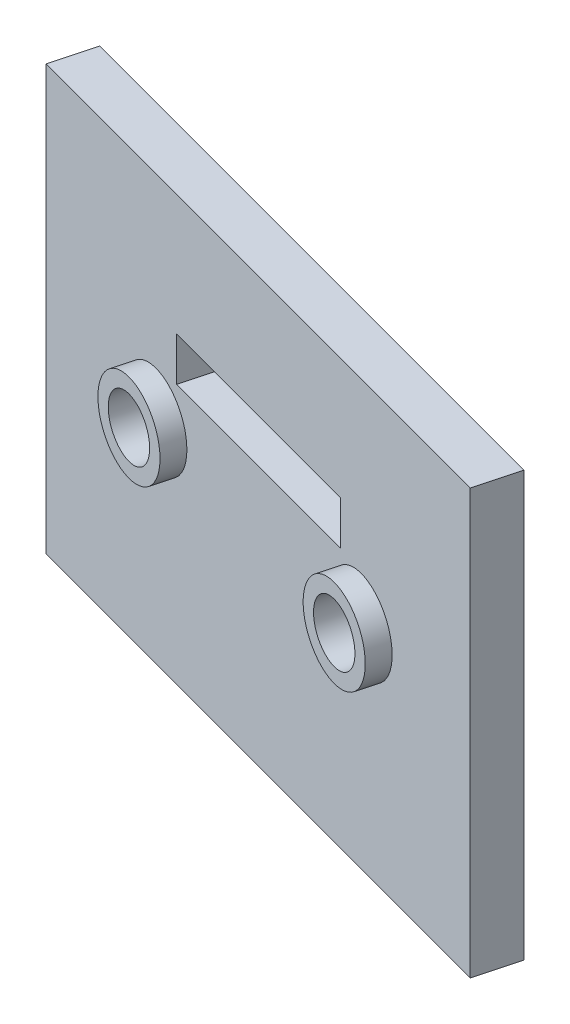
ISO-10303-21;
HEADER;
FILE_DESCRIPTION(('STEP AP214'),'2;1');
FILE_NAME('part.step','',(''),(''),'','','');
FILE_SCHEMA(('AUTOMOTIVE_DESIGN { 1 0 10303 214 1 1 1 1 }'));
ENDSEC;
DATA;
#1=APPLICATION_CONTEXT('core data for automotive mechanical design processes');
#2=APPLICATION_PROTOCOL_DEFINITION('international standard','automotive_design',2000,#1);
#3=PRODUCT_CONTEXT('',#1,'mechanical');
#4=PRODUCT('Part','Part','',(#3));
#5=PRODUCT_RELATED_PRODUCT_CATEGORY('part','',(#4));
#6=PRODUCT_DEFINITION_FORMATION('','',#4);
#7=PRODUCT_DEFINITION_CONTEXT('part definition',#1,'design');
#8=PRODUCT_DEFINITION('design','',#6,#7);
#9=PRODUCT_DEFINITION_SHAPE('','',#8);
#10=(LENGTH_UNIT() NAMED_UNIT(*) SI_UNIT(.MILLI.,.METRE.));
#11=(NAMED_UNIT(*) PLANE_ANGLE_UNIT() SI_UNIT($,.RADIAN.));
#12=(NAMED_UNIT(*) SI_UNIT($,.STERADIAN.) SOLID_ANGLE_UNIT());
#13=UNCERTAINTY_MEASURE_WITH_UNIT(LENGTH_MEASURE(1.E-05),#10,'distance_accuracy_value','');
#14=(GEOMETRIC_REPRESENTATION_CONTEXT(3) GLOBAL_UNCERTAINTY_ASSIGNED_CONTEXT((#13)) GLOBAL_UNIT_ASSIGNED_CONTEXT((#10,
#11,#12)) REPRESENTATION_CONTEXT('',''));
#15=CARTESIAN_POINT('',(0.,0.,0.));
#16=DIRECTION('',(0.,0.,1.));
#17=DIRECTION('',(1.,0.,0.));
#18=AXIS2_PLACEMENT_3D('',#15,#16,#17);
#19=CARTESIAN_POINT('',(47.9030584365936,15.,8.28023479431847));
#20=DIRECTION('',(-0.965925826289069,0.,-0.258819045102521));
#21=DIRECTION('',(-0.258819045102521,0.,0.965925826289069));
#22=AXIS2_PLACEMENT_3D('',#19,#20,#21);
#23=PLANE('',#22);
#24=DIRECTION('',(0.,1.,0.));
#25=VECTOR('',#24,1.);
#26=CARTESIAN_POINT('',(48.6795155719012,15.,5.38245731545126));
#27=LINE('',#26,#25);
#28=CARTESIAN_POINT('',(48.6795155719012,-14.,5.38245731545126));
#29=VERTEX_POINT('',#28);
#30=CARTESIAN_POINT('',(48.6795155719012,15.,5.38245731545126));
#31=VERTEX_POINT('',#30);
#32=EDGE_CURVE('E153',#29,#31,#27,.T.);
#33=ORIENTED_EDGE('',*,*,#32,.T.);
#34=DIRECTION('',(0.258819045102521,0.,-0.965925826289069));
#35=VECTOR('',#34,1.);
#36=CARTESIAN_POINT('',(47.9030584365936,15.,8.28023479431847));
#37=LINE('',#36,#35);
#38=CARTESIAN_POINT('',(47.9030584365936,15.,8.28023479431847));
#39=VERTEX_POINT('',#38);
#40=EDGE_CURVE('E46',#39,#31,#37,.T.);
#41=ORIENTED_EDGE('',*,*,#40,.F.);
#42=DIRECTION('',(0.,1.,0.));
#43=VECTOR('',#42,1.);
#44=CARTESIAN_POINT('',(47.9030584365936,15.,8.28023479431847));
#45=LINE('',#44,#43);
#46=CARTESIAN_POINT('',(47.9030584365936,-14.,8.28023479431847));
#47=VERTEX_POINT('',#46);
#48=EDGE_CURVE('E156',#47,#39,#45,.T.);
#49=ORIENTED_EDGE('',*,*,#48,.F.);
#50=DIRECTION('',(0.258819045102521,0.,-0.965925826289069));
#51=VECTOR('',#50,1.);
#52=CARTESIAN_POINT('',(47.9030584365936,-14.,8.28023479431847));
#53=LINE('',#52,#51);
#54=EDGE_CURVE('E166',#47,#29,#53,.T.);
#55=ORIENTED_EDGE('',*,*,#54,.T.);
#56=EDGE_LOOP('',(#33,#41,#49,#55));
#57=FACE_BOUND('',#56,.T.);
#58=ADVANCED_FACE('F39',(#57),#23,.F.);
#59=CARTESIAN_POINT('',(8.3000995587418,15.,-2.33134605488488));
#60=DIRECTION('',(0.,-1.,0.));
#61=DIRECTION('',(0.258819045102521,0.,-0.965925826289069));
#62=AXIS2_PLACEMENT_3D('',#59,#60,#61);
#63=PLANE('',#62);
#64=DIRECTION('',(-0.965925826289069,0.,-0.258819045102521));
#65=VECTOR('',#64,1.);
#66=CARTESIAN_POINT('',(9.07655669404936,15.,-5.22912353375209));
#67=LINE('',#66,#65);
#68=CARTESIAN_POINT('',(9.07655669404936,15.,-5.22912353375209));
#69=VERTEX_POINT('',#68);
#70=EDGE_CURVE('E169',#31,#69,#67,.T.);
#71=ORIENTED_EDGE('',*,*,#70,.T.);
#72=DIRECTION('',(0.258819045102521,0.,-0.965925826289069));
#73=VECTOR('',#72,1.);
#74=CARTESIAN_POINT('',(8.3000995587418,15.,-2.33134605488488));
#75=LINE('',#74,#73);
#76=CARTESIAN_POINT('',(8.3000995587418,15.,-2.33134605488488));
#77=VERTEX_POINT('',#76);
#78=EDGE_CURVE('E179',#77,#69,#75,.T.);
#79=ORIENTED_EDGE('',*,*,#78,.F.);
#80=DIRECTION('',(-0.965925826289069,0.,-0.258819045102521));
#81=VECTOR('',#80,1.);
#82=CARTESIAN_POINT('',(8.3000995587418,15.,-2.33134605488488));
#83=LINE('',#82,#81);
#84=EDGE_CURVE('E159',#39,#77,#83,.T.);
#85=ORIENTED_EDGE('',*,*,#84,.F.);
#86=ORIENTED_EDGE('',*,*,#40,.T.);
#87=EDGE_LOOP('',(#71,#79,#85,#86));
#88=FACE_BOUND('',#87,.T.);
#89=ADVANCED_FACE('F184',(#88),#63,.F.);
#90=CARTESIAN_POINT('',(8.3000995587418,15.,-2.33134605488488));
#91=DIRECTION('',(0.965925826289069,0.,0.258819045102521));
#92=DIRECTION('',(0.,1.,0.));
#93=AXIS2_PLACEMENT_3D('',#90,#91,#92);
#94=PLANE('',#93);
#95=DIRECTION('',(0.,-1.,0.));
#96=VECTOR('',#95,1.);
#97=CARTESIAN_POINT('',(9.07655669404936,15.,-5.22912353375209));
#98=LINE('',#97,#96);
#99=CARTESIAN_POINT('',(9.07655669404937,-14.,-5.22912353375209));
#100=VERTEX_POINT('',#99);
#101=EDGE_CURVE('E171',#69,#100,#98,.T.);
#102=ORIENTED_EDGE('',*,*,#101,.T.);
#103=DIRECTION('',(0.258819045102521,0.,-0.965925826289069));
#104=VECTOR('',#103,1.);
#105=CARTESIAN_POINT('',(8.3000995587418,-14.,-2.33134605488488));
#106=LINE('',#105,#104);
#107=CARTESIAN_POINT('',(8.3000995587418,-14.,-2.33134605488488));
#108=VERTEX_POINT('',#107);
#109=EDGE_CURVE('E176',#108,#100,#106,.T.);
#110=ORIENTED_EDGE('',*,*,#109,.F.);
#111=DIRECTION('',(0.,-1.,0.));
#112=VECTOR('',#111,1.);
#113=CARTESIAN_POINT('',(8.3000995587418,15.,-2.33134605488488));
#114=LINE('',#113,#112);
#115=EDGE_CURVE('E162',#77,#108,#114,.T.);
#116=ORIENTED_EDGE('',*,*,#115,.F.);
#117=ORIENTED_EDGE('',*,*,#78,.T.);
#118=EDGE_LOOP('',(#102,#110,#116,#117));
#119=FACE_BOUND('',#118,.T.);
#120=ADVANCED_FACE('F195',(#119),#94,.F.);
#121=CARTESIAN_POINT('',(8.3000995587418,-14.,-2.33134605488488));
#122=DIRECTION('',(0.,1.,0.));
#123=DIRECTION('',(-0.258819045102521,0.,0.965925826289069));
#124=AXIS2_PLACEMENT_3D('',#121,#122,#123);
#125=PLANE('',#124);
#126=DIRECTION('',(0.965925826289069,0.,0.258819045102521));
#127=VECTOR('',#126,1.);
#128=CARTESIAN_POINT('',(9.07655669404937,-14.,-5.22912353375209));
#129=LINE('',#128,#127);
#130=EDGE_CURVE('E160',#100,#29,#129,.T.);
#131=ORIENTED_EDGE('',*,*,#130,.T.);
#132=ORIENTED_EDGE('',*,*,#54,.F.);
#133=DIRECTION('',(0.965925826289069,0.,0.258819045102521));
#134=VECTOR('',#133,1.);
#135=CARTESIAN_POINT('',(8.3000995587418,-14.,-2.33134605488488));
#136=LINE('',#135,#134);
#137=EDGE_CURVE('E164',#108,#47,#136,.T.);
#138=ORIENTED_EDGE('',*,*,#137,.F.);
#139=ORIENTED_EDGE('',*,*,#109,.T.);
#140=EDGE_LOOP('',(#131,#132,#138,#139));
#141=FACE_BOUND('',#140,.T.);
#142=ADVANCED_FACE('F199',(#141),#125,.F.);
#143=CARTESIAN_POINT('',(28.1015789976677,0.5,2.97444436971679));
#144=DIRECTION('',(-0.258819045102521,0.,0.965925826289069));
#145=DIRECTION('',(0.965925826289069,0.,0.258819045102521));
#146=AXIS2_PLACEMENT_3D('',#143,#144,#145);
#147=PLANE('',#146);
#148=DIRECTION('',(0.,1.,0.));
#149=VECTOR('',#148,1.);
#150=CARTESIAN_POINT('',(35.7835278321749,0.5,5.03281635622019));
#151=LINE('',#150,#149);
#152=CARTESIAN_POINT('',(35.7835278321749,3.75000000000001,5.0328163562202));
#153=VERTEX_POINT('',#152);
#154=CARTESIAN_POINT('',(35.7835278321749,6.75000000000001,5.0328163562202));
#155=VERTEX_POINT('',#154);
#156=EDGE_CURVE('E125',#153,#155,#151,.T.);
#157=ORIENTED_EDGE('',*,*,#156,.F.);
#158=DIRECTION('',(0.965925826289068,0.,0.258819045102521));
#159=VECTOR('',#158,1.);
#160=CARTESIAN_POINT('',(28.1015789976677,3.75000000000001,2.97444436971679));
#161=LINE('',#160,#159);
#162=CARTESIAN_POINT('',(20.4830859415634,3.75000000000001,0.93307530779153));
#163=VERTEX_POINT('',#162);
#164=EDGE_CURVE('E127',#163,#153,#161,.T.);
#165=ORIENTED_EDGE('',*,*,#164,.F.);
#166=DIRECTION('',(0.,-1.,0.));
#167=VECTOR('',#166,1.);
#168=CARTESIAN_POINT('',(20.4830859415634,0.5,0.933075307791529));
#169=LINE('',#168,#167);
#170=CARTESIAN_POINT('',(20.4830859415634,6.75000000000001,0.933075307791529));
#171=VERTEX_POINT('',#170);
#172=EDGE_CURVE('E106',#171,#163,#169,.T.);
#173=ORIENTED_EDGE('',*,*,#172,.F.);
#174=DIRECTION('',(-0.965925826289068,0.,-0.258819045102521));
#175=VECTOR('',#174,1.);
#176=CARTESIAN_POINT('',(28.1015789976677,6.75000000000001,2.97444436971679));
#177=LINE('',#176,#175);
#178=EDGE_CURVE('E129',#155,#171,#177,.T.);
#179=ORIENTED_EDGE('',*,*,#178,.F.);
#180=EDGE_LOOP('',(#157,#165,#173,#179));
#181=FACE_BOUND('',#180,.T.);
#182=CARTESIAN_POINT('',(37.715379484753,0.500000000000006,5.55045444642524));
#183=DIRECTION('',(-0.258819045102521,0.,0.965925826289069));
#184=DIRECTION('',(0.965925826289069,0.,0.258819045102521));
#185=AXIS2_PLACEMENT_3D('',#182,#183,#184);
#186=CIRCLE('',#185,3.);
#187=CARTESIAN_POINT('',(40.6131569636202,0.500000000000006,6.3269115817328));
#188=VERTEX_POINT('',#187);
#189=EDGE_CURVE('E143',#188,#188,#186,.T.);
#190=ORIENTED_EDGE('',*,*,#189,.F.);
#191=EDGE_LOOP('',(#190));
#192=FACE_BOUND('',#191,.T.);
#193=CARTESIAN_POINT('',(18.5512342889853,0.500000000000006,0.415437217586492));
#194=DIRECTION('',(-0.258819045102521,0.,0.965925826289069));
#195=DIRECTION('',(0.965925826289069,0.,0.258819045102521));
#196=AXIS2_PLACEMENT_3D('',#193,#194,#195);
#197=CIRCLE('',#196,3.);
#198=CARTESIAN_POINT('',(21.4490117678525,0.500000000000006,1.19189435289405));
#199=VERTEX_POINT('',#198);
#200=EDGE_CURVE('E147',#199,#199,#197,.T.);
#201=ORIENTED_EDGE('',*,*,#200,.F.);
#202=EDGE_LOOP('',(#201));
#203=FACE_BOUND('',#202,.T.);
#204=ORIENTED_EDGE('',*,*,#48,.T.);
#205=ORIENTED_EDGE('',*,*,#84,.T.);
#206=ORIENTED_EDGE('',*,*,#115,.T.);
#207=ORIENTED_EDGE('',*,*,#137,.T.);
#208=EDGE_LOOP('',(#204,#205,#206,#207));
#209=FACE_BOUND('',#208,.T.);
#210=ADVANCED_FACE('F201',(#181,#192,#203,#209),#147,.T.);
#211=CARTESIAN_POINT('',(28.8780361329753,0.5,0.0766668908495881));
#212=DIRECTION('',(-0.258819045102521,0.,0.965925826289069));
#213=DIRECTION('',(0.965925826289069,0.,0.258819045102521));
#214=AXIS2_PLACEMENT_3D('',#211,#212,#213);
#215=PLANE('',#214);
#216=CARTESIAN_POINT('',(38.4918366200606,0.500000000000006,2.65267696755803));
#217=DIRECTION('',(-0.258819045102521,0.,0.965925826289069));
#218=DIRECTION('',(0.965925826289069,0.,0.258819045102521));
#219=AXIS2_PLACEMENT_3D('',#216,#217,#218);
#220=CIRCLE('',#219,2.);
#221=CARTESIAN_POINT('',(40.4236882726387,0.500000000000006,3.17031505776307));
#222=VERTEX_POINT('',#221);
#223=EDGE_CURVE('E140',#222,#222,#220,.T.);
#224=ORIENTED_EDGE('',*,*,#223,.T.);
#225=EDGE_LOOP('',(#224));
#226=FACE_BOUND('',#225,.T.);
#227=DIRECTION('',(-0.965925826289068,0.,-0.258819045102521));
#228=VECTOR('',#227,1.);
#229=CARTESIAN_POINT('',(36.5599849674824,3.75000000000001,2.13503887735299));
#230=LINE('',#229,#228);
#231=CARTESIAN_POINT('',(36.5599849674824,3.75000000000001,2.13503887735299));
#232=VERTEX_POINT('',#231);
#233=CARTESIAN_POINT('',(21.259543076871,3.75000000000001,-1.96470217107567));
#234=VERTEX_POINT('',#233);
#235=EDGE_CURVE('E111',#232,#234,#230,.T.);
#236=ORIENTED_EDGE('',*,*,#235,.F.);
#237=DIRECTION('',(0.,1.,0.));
#238=VECTOR('',#237,1.);
#239=CARTESIAN_POINT('',(36.5599849674824,0.5,2.13503887735299));
#240=LINE('',#239,#238);
#241=CARTESIAN_POINT('',(36.5599849674824,6.75000000000001,2.13503887735299));
#242=VERTEX_POINT('',#241);
#243=EDGE_CURVE('E120',#232,#242,#240,.T.);
#244=ORIENTED_EDGE('',*,*,#243,.T.);
#245=DIRECTION('',(-0.965925826289068,0.,-0.258819045102521));
#246=VECTOR('',#245,1.);
#247=CARTESIAN_POINT('',(28.8780361329753,6.75000000000001,0.0766668908495881));
#248=LINE('',#247,#246);
#249=CARTESIAN_POINT('',(21.259543076871,6.75000000000001,-1.96470217107568));
#250=VERTEX_POINT('',#249);
#251=EDGE_CURVE('E11',#242,#250,#248,.T.);
#252=ORIENTED_EDGE('',*,*,#251,.T.);
#253=DIRECTION('',(0.,-1.,0.));
#254=VECTOR('',#253,1.);
#255=CARTESIAN_POINT('',(21.259543076871,0.5,-1.96470217107568));
#256=LINE('',#255,#254);
#257=EDGE_CURVE('E103',#250,#234,#256,.T.);
#258=ORIENTED_EDGE('',*,*,#257,.T.);
#259=EDGE_LOOP('',(#236,#244,#252,#258));
#260=FACE_BOUND('',#259,.T.);
#261=CARTESIAN_POINT('',(19.3276914242928,0.500000000000006,-2.48234026128071));
#262=DIRECTION('',(-0.258819045102521,0.,0.965925826289069));
#263=DIRECTION('',(0.965925826289069,0.,0.258819045102521));
#264=AXIS2_PLACEMENT_3D('',#261,#262,#263);
#265=CIRCLE('',#264,2.);
#266=CARTESIAN_POINT('',(21.259543076871,0.500000000000006,-1.96470217107567));
#267=VERTEX_POINT('',#266);
#268=EDGE_CURVE('E134',#267,#267,#265,.T.);
#269=ORIENTED_EDGE('',*,*,#268,.T.);
#270=EDGE_LOOP('',(#269));
#271=FACE_BOUND('',#270,.T.);
#272=ORIENTED_EDGE('',*,*,#32,.F.);
#273=ORIENTED_EDGE('',*,*,#130,.F.);
#274=ORIENTED_EDGE('',*,*,#101,.F.);
#275=ORIENTED_EDGE('',*,*,#70,.F.);
#276=EDGE_LOOP('',(#272,#273,#274,#275));
#277=FACE_BOUND('',#276,.T.);
#278=ADVANCED_FACE('F117',(#226,#260,#271,#277),#215,.F.);
#279=CARTESIAN_POINT('',(18.1630057213315,0.500000000000006,1.8643259570201));
#280=DIRECTION('',(0.258819045102521,0.,-0.965925826289069));
#281=DIRECTION('',(-0.965925826289069,0.,-0.258819045102521));
#282=AXIS2_PLACEMENT_3D('',#279,#280,#281);
#283=CYLINDRICAL_SURFACE('',#282,3.);
#284=CARTESIAN_POINT('',(18.1630057213315,0.500000000000006,1.8643259570201));
#285=DIRECTION('',(-0.258819045102521,0.,0.965925826289069));
#286=DIRECTION('',(0.965925826289069,0.,0.258819045102521));
#287=AXIS2_PLACEMENT_3D('',#284,#285,#286);
#288=CIRCLE('',#287,3.);
#289=CARTESIAN_POINT('',(21.0607832001987,0.500000000000006,2.64078309232766));
#290=VERTEX_POINT('',#289);
#291=EDGE_CURVE('E150',#290,#290,#288,.T.);
#292=ORIENTED_EDGE('',*,*,#291,.F.);
#293=EDGE_LOOP('',(#292));
#294=FACE_BOUND('',#293,.T.);
#295=ORIENTED_EDGE('',*,*,#200,.T.);
#296=EDGE_LOOP('',(#295));
#297=FACE_BOUND('',#296,.T.);
#298=ADVANCED_FACE('F207',(#294,#297),#283,.T.);
#299=CARTESIAN_POINT('',(18.1630057213315,0.500000000000006,1.8643259570201));
#300=DIRECTION('',(-0.258819045102521,0.,0.965925826289069));
#301=DIRECTION('',(0.965925826289069,0.,0.258819045102521));
#302=AXIS2_PLACEMENT_3D('',#299,#300,#301);
#303=PLANE('',#302);
#304=CARTESIAN_POINT('',(18.1630057213315,0.500000000000006,1.8643259570201));
#305=DIRECTION('',(-0.258819045102521,0.,0.965925826289069));
#306=DIRECTION('',(0.965925826289069,0.,0.258819045102521));
#307=AXIS2_PLACEMENT_3D('',#304,#305,#306);
#308=CIRCLE('',#307,2.);
#309=CARTESIAN_POINT('',(20.0948573739096,0.500000000000006,2.38196404722514));
#310=VERTEX_POINT('',#309);
#311=EDGE_CURVE('E131',#310,#310,#308,.T.);
#312=ORIENTED_EDGE('',*,*,#311,.F.);
#313=EDGE_LOOP('',(#312));
#314=FACE_BOUND('',#313,.T.);
#315=ORIENTED_EDGE('',*,*,#291,.T.);
#316=EDGE_LOOP('',(#315));
#317=FACE_BOUND('',#316,.T.);
#318=ADVANCED_FACE('F237',(#314,#317),#303,.T.);
#319=CARTESIAN_POINT('',(37.3271509170992,0.500000000000006,6.99934318585884));
#320=DIRECTION('',(0.258819045102521,0.,-0.965925826289069));
#321=DIRECTION('',(-0.965925826289069,0.,-0.258819045102521));
#322=AXIS2_PLACEMENT_3D('',#319,#320,#321);
#323=CYLINDRICAL_SURFACE('',#322,3.);
#324=CARTESIAN_POINT('',(37.3271509170992,0.500000000000006,6.99934318585884));
#325=DIRECTION('',(-0.258819045102521,0.,0.965925826289069));
#326=DIRECTION('',(0.965925826289069,0.,0.258819045102521));
#327=AXIS2_PLACEMENT_3D('',#324,#325,#326);
#328=CIRCLE('',#327,3.);
#329=CARTESIAN_POINT('',(40.2249283959665,0.500000000000006,7.7758003211664));
#330=VERTEX_POINT('',#329);
#331=EDGE_CURVE('E144',#330,#330,#328,.T.);
#332=ORIENTED_EDGE('',*,*,#331,.F.);
#333=EDGE_LOOP('',(#332));
#334=FACE_BOUND('',#333,.T.);
#335=ORIENTED_EDGE('',*,*,#189,.T.);
#336=EDGE_LOOP('',(#335));
#337=FACE_BOUND('',#336,.T.);
#338=ADVANCED_FACE('F232',(#334,#337),#323,.T.);
#339=CARTESIAN_POINT('',(37.3271509170992,0.500000000000006,6.99934318585884));
#340=DIRECTION('',(-0.258819045102521,0.,0.965925826289069));
#341=DIRECTION('',(0.965925826289069,0.,0.258819045102521));
#342=AXIS2_PLACEMENT_3D('',#339,#340,#341);
#343=PLANE('',#342);
#344=CARTESIAN_POINT('',(37.3271509170992,0.500000000000006,6.99934318585884));
#345=DIRECTION('',(-0.258819045102521,0.,0.965925826289069));
#346=DIRECTION('',(0.965925826289069,0.,0.258819045102521));
#347=AXIS2_PLACEMENT_3D('',#344,#345,#346);
#348=CIRCLE('',#347,2.);
#349=CARTESIAN_POINT('',(39.2590025696774,0.500000000000006,7.51698127606388));
#350=VERTEX_POINT('',#349);
#351=EDGE_CURVE('E137',#350,#350,#348,.T.);
#352=ORIENTED_EDGE('',*,*,#351,.F.);
#353=EDGE_LOOP('',(#352));
#354=FACE_BOUND('',#353,.T.);
#355=ORIENTED_EDGE('',*,*,#331,.T.);
#356=EDGE_LOOP('',(#355));
#357=FACE_BOUND('',#356,.T.);
#358=ADVANCED_FACE('F236',(#354,#357),#343,.T.);
#359=CARTESIAN_POINT('',(37.3271509170992,0.500000000000006,6.99934318585884));
#360=DIRECTION('',(-0.258819045102521,0.,0.965925826289069));
#361=DIRECTION('',(0.965925826289069,0.,0.258819045102521));
#362=AXIS2_PLACEMENT_3D('',#359,#360,#361);
#363=CYLINDRICAL_SURFACE('',#362,2.);
#364=ORIENTED_EDGE('',*,*,#223,.F.);
#365=EDGE_LOOP('',(#364));
#366=FACE_BOUND('',#365,.T.);
#367=ORIENTED_EDGE('',*,*,#351,.T.);
#368=EDGE_LOOP('',(#367));
#369=FACE_BOUND('',#368,.T.);
#370=ADVANCED_FACE('F246',(#366,#369),#363,.F.);
#371=CARTESIAN_POINT('',(18.1630057213315,0.500000000000006,1.8643259570201));
#372=DIRECTION('',(-0.258819045102521,0.,0.965925826289069));
#373=DIRECTION('',(0.965925826289069,0.,0.258819045102521));
#374=AXIS2_PLACEMENT_3D('',#371,#372,#373);
#375=CYLINDRICAL_SURFACE('',#374,2.);
#376=ORIENTED_EDGE('',*,*,#268,.F.);
#377=EDGE_LOOP('',(#376));
#378=FACE_BOUND('',#377,.T.);
#379=ORIENTED_EDGE('',*,*,#311,.T.);
#380=EDGE_LOOP('',(#379));
#381=FACE_BOUND('',#380,.T.);
#382=ADVANCED_FACE('F257',(#378,#381),#375,.F.);
#383=CARTESIAN_POINT('',(32.6776992909446,6.75000000000001,16.623926271689));
#384=DIRECTION('',(0.,1.,0.));
#385=DIRECTION('',(0.,0.,1.));
#386=AXIS2_PLACEMENT_3D('',#383,#384,#385);
#387=PLANE('',#386);
#388=ORIENTED_EDGE('',*,*,#178,.T.);
#389=DIRECTION('',(0.258819045102521,0.,-0.965925826289068));
#390=VECTOR('',#389,1.);
#391=CARTESIAN_POINT('',(17.3772574003332,6.75000000000001,12.5241852232604));
#392=LINE('',#391,#390);
#393=EDGE_CURVE('E108',#171,#250,#392,.T.);
#394=ORIENTED_EDGE('',*,*,#393,.T.);
#395=ORIENTED_EDGE('',*,*,#251,.F.);
#396=DIRECTION('',(0.258819045102521,0.,-0.965925826289068));
#397=VECTOR('',#396,1.);
#398=CARTESIAN_POINT('',(32.6776992909446,6.75000000000001,16.623926271689));
#399=LINE('',#398,#397);
#400=EDGE_CURVE('E115',#155,#242,#399,.T.);
#401=ORIENTED_EDGE('',*,*,#400,.F.);
#402=EDGE_LOOP('',(#388,#394,#395,#401));
#403=FACE_BOUND('',#402,.T.);
#404=ADVANCED_FACE('F269',(#403),#387,.F.);
#405=CARTESIAN_POINT('',(32.6776992909446,6.75000000000001,16.623926271689));
#406=DIRECTION('',(0.965925826289068,0.,0.258819045102521));
#407=DIRECTION('',(0.258819045102521,0.,-0.965925826289068));
#408=AXIS2_PLACEMENT_3D('',#405,#406,#407);
#409=PLANE('',#408);
#410=ORIENTED_EDGE('',*,*,#156,.T.);
#411=ORIENTED_EDGE('',*,*,#400,.T.);
#412=ORIENTED_EDGE('',*,*,#243,.F.);
#413=DIRECTION('',(0.258819045102521,0.,-0.965925826289068));
#414=VECTOR('',#413,1.);
#415=CARTESIAN_POINT('',(32.6776992909446,3.75000000000001,16.623926271689));
#416=LINE('',#415,#414);
#417=EDGE_CURVE('E58',#153,#232,#416,.T.);
#418=ORIENTED_EDGE('',*,*,#417,.F.);
#419=EDGE_LOOP('',(#410,#411,#412,#418));
#420=FACE_BOUND('',#419,.T.);
#421=ADVANCED_FACE('F279',(#420),#409,.F.);
#422=CARTESIAN_POINT('',(17.3772574003332,6.75000000000001,12.5241852232604));
#423=DIRECTION('',(-0.965925826289068,0.,-0.258819045102521));
#424=DIRECTION('',(-0.258819045102521,0.,0.965925826289068));
#425=AXIS2_PLACEMENT_3D('',#422,#423,#424);
#426=PLANE('',#425);
#427=ORIENTED_EDGE('',*,*,#172,.T.);
#428=DIRECTION('',(0.258819045102521,0.,-0.965925826289068));
#429=VECTOR('',#428,1.);
#430=CARTESIAN_POINT('',(17.3772574003332,3.75000000000001,12.5241852232604));
#431=LINE('',#430,#429);
#432=EDGE_CURVE('E53',#163,#234,#431,.T.);
#433=ORIENTED_EDGE('',*,*,#432,.T.);
#434=ORIENTED_EDGE('',*,*,#257,.F.);
#435=ORIENTED_EDGE('',*,*,#393,.F.);
#436=EDGE_LOOP('',(#427,#433,#434,#435));
#437=FACE_BOUND('',#436,.T.);
#438=ADVANCED_FACE('F100',(#437),#426,.F.);
#439=CARTESIAN_POINT('',(32.6776992909446,3.75000000000001,16.623926271689));
#440=DIRECTION('',(0.,-1.,0.));
#441=DIRECTION('',(0.,0.,-1.));
#442=AXIS2_PLACEMENT_3D('',#439,#440,#441);
#443=PLANE('',#442);
#444=ORIENTED_EDGE('',*,*,#164,.T.);
#445=ORIENTED_EDGE('',*,*,#417,.T.);
#446=ORIENTED_EDGE('',*,*,#235,.T.);
#447=ORIENTED_EDGE('',*,*,#432,.F.);
#448=EDGE_LOOP('',(#444,#445,#446,#447));
#449=FACE_BOUND('',#448,.T.);
#450=ADVANCED_FACE('F112',(#449),#443,.F.);
#451=CLOSED_SHELL('',(#58,#89,#120,#142,#210,#278,#298,#318,#338,#358,#370,#382,#404,#421,#438,#450));
#452=MANIFOLD_SOLID_BREP('B2',#451);
#453=ADVANCED_BREP_SHAPE_REPRESENTATION('',(#18,#452),#14);
#454=SHAPE_DEFINITION_REPRESENTATION(#9,#453);
ENDSEC;
END-ISO-10303-21;
